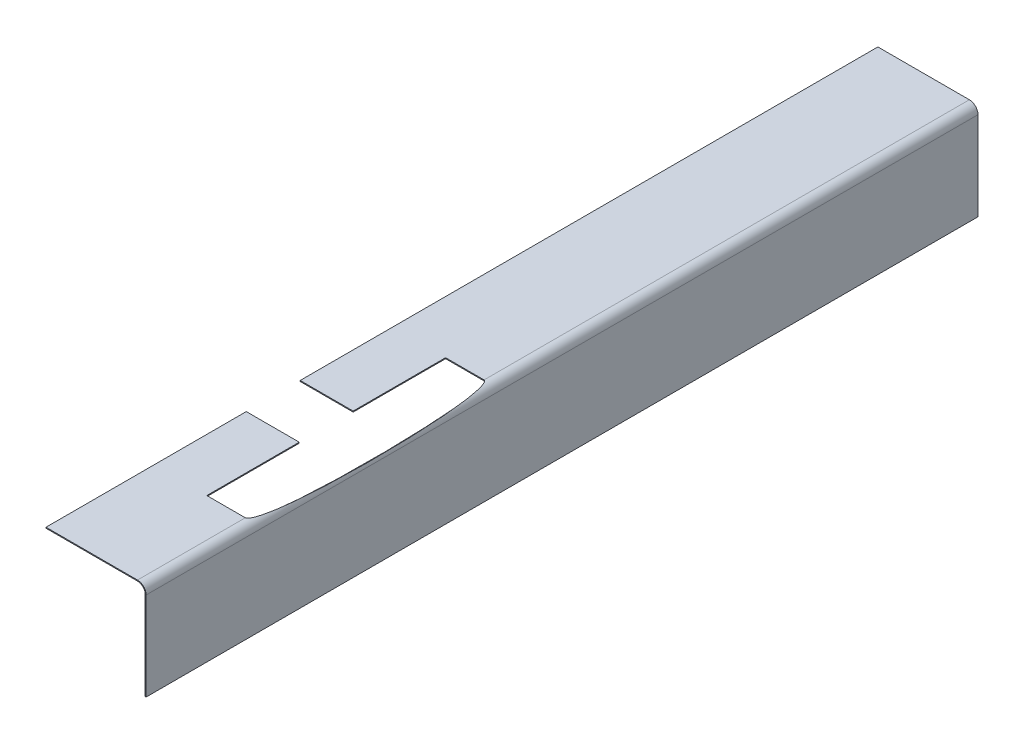
ISO-10303-21;
HEADER;
FILE_DESCRIPTION(('STEP AP214'),'2;1');
FILE_NAME('part.step','',(''),(''),'','','');
FILE_SCHEMA(('AUTOMOTIVE_DESIGN { 1 0 10303 214 1 1 1 1 }'));
ENDSEC;
DATA;
#1=APPLICATION_CONTEXT('core data for automotive mechanical design processes');
#2=APPLICATION_PROTOCOL_DEFINITION('international standard','automotive_design',2000,#1);
#3=PRODUCT_CONTEXT('',#1,'mechanical');
#4=PRODUCT('Part','Part','',(#3));
#5=PRODUCT_RELATED_PRODUCT_CATEGORY('part','',(#4));
#6=PRODUCT_DEFINITION_FORMATION('','',#4);
#7=PRODUCT_DEFINITION_CONTEXT('part definition',#1,'design');
#8=PRODUCT_DEFINITION('design','',#6,#7);
#9=PRODUCT_DEFINITION_SHAPE('','',#8);
#10=(LENGTH_UNIT() NAMED_UNIT(*) SI_UNIT(.MILLI.,.METRE.));
#11=(NAMED_UNIT(*) PLANE_ANGLE_UNIT() SI_UNIT($,.RADIAN.));
#12=(NAMED_UNIT(*) SI_UNIT($,.STERADIAN.) SOLID_ANGLE_UNIT());
#13=UNCERTAINTY_MEASURE_WITH_UNIT(LENGTH_MEASURE(1.E-05),#10,'distance_accuracy_value','');
#14=(GEOMETRIC_REPRESENTATION_CONTEXT(3) GLOBAL_UNCERTAINTY_ASSIGNED_CONTEXT((#13)) GLOBAL_UNIT_ASSIGNED_CONTEXT((#10,
#11,#12)) REPRESENTATION_CONTEXT('',''));
#15=CARTESIAN_POINT('',(0.,0.,0.));
#16=DIRECTION('',(0.,0.,1.));
#17=DIRECTION('',(1.,0.,0.));
#18=AXIS2_PLACEMENT_3D('',#15,#16,#17);
#19=CARTESIAN_POINT('',(65.,0.,0.));
#20=DIRECTION('',(0.,0.,-1.));
#21=DIRECTION('',(0.,-1.,0.));
#22=AXIS2_PLACEMENT_3D('',#19,#20,#21);
#23=PLANE('',#22);
#24=DIRECTION('',(1.,0.,0.));
#25=VECTOR('',#24,1.);
#26=CARTESIAN_POINT('',(65.,57.39294,0.));
#27=LINE('',#26,#25);
#28=CARTESIAN_POINT('',(64.39294,57.39294,0.));
#29=VERTEX_POINT('',#28);
#30=CARTESIAN_POINT('',(65.,57.39294,0.));
#31=VERTEX_POINT('',#30);
#32=EDGE_CURVE('E11',#29,#31,#27,.T.);
#33=ORIENTED_EDGE('',*,*,#32,.F.);
#34=DIRECTION('',(0.,1.,0.));
#35=VECTOR('',#34,1.);
#36=CARTESIAN_POINT('',(64.39294,0.,0.));
#37=LINE('',#36,#35);
#38=CARTESIAN_POINT('',(64.39294,0.,0.));
#39=VERTEX_POINT('',#38);
#40=EDGE_CURVE('E115',#29,#39,#37,.F.);
#41=ORIENTED_EDGE('',*,*,#40,.T.);
#42=DIRECTION('',(1.,0.,0.));
#43=VECTOR('',#42,1.);
#44=CARTESIAN_POINT('',(65.,0.,0.));
#45=LINE('',#44,#43);
#46=CARTESIAN_POINT('',(65.,0.,0.));
#47=VERTEX_POINT('',#46);
#48=EDGE_CURVE('E50',#39,#47,#45,.T.);
#49=ORIENTED_EDGE('',*,*,#48,.T.);
#50=DIRECTION('',(0.,-1.,0.));
#51=VECTOR('',#50,1.);
#52=CARTESIAN_POINT('',(65.,0.,0.));
#53=LINE('',#52,#51);
#54=EDGE_CURVE('E118',#31,#47,#53,.T.);
#55=ORIENTED_EDGE('',*,*,#54,.F.);
#56=EDGE_LOOP('',(#33,#41,#49,#55));
#57=FACE_BOUND('',#56,.T.);
#58=ADVANCED_FACE('F40',(#57),#23,.F.);
#59=CARTESIAN_POINT('',(65.,0.,0.));
#60=DIRECTION('',(0.,1.,0.));
#61=DIRECTION('',(0.,0.,-1.));
#62=AXIS2_PLACEMENT_3D('',#59,#60,#61);
#63=PLANE('',#62);
#64=ORIENTED_EDGE('',*,*,#48,.F.);
#65=DIRECTION('',(0.,0.,1.));
#66=VECTOR('',#65,1.);
#67=CARTESIAN_POINT('',(64.39294,0.,0.));
#68=LINE('',#67,#66);
#69=CARTESIAN_POINT('',(64.39294,0.,-540.));
#70=VERTEX_POINT('',#69);
#71=EDGE_CURVE('E146',#39,#70,#68,.F.);
#72=ORIENTED_EDGE('',*,*,#71,.T.);
#73=DIRECTION('',(1.,0.,0.));
#74=VECTOR('',#73,1.);
#75=CARTESIAN_POINT('',(65.,0.,-540.));
#76=LINE('',#75,#74);
#77=CARTESIAN_POINT('',(65.,0.,-540.));
#78=VERTEX_POINT('',#77);
#79=EDGE_CURVE('E312',#70,#78,#76,.T.);
#80=ORIENTED_EDGE('',*,*,#79,.T.);
#81=DIRECTION('',(0.,0.,-1.));
#82=VECTOR('',#81,1.);
#83=CARTESIAN_POINT('',(65.,0.,0.));
#84=LINE('',#83,#82);
#85=EDGE_CURVE('E322',#47,#78,#84,.T.);
#86=ORIENTED_EDGE('',*,*,#85,.F.);
#87=EDGE_LOOP('',(#64,#72,#80,#86));
#88=FACE_BOUND('',#87,.T.);
#89=ADVANCED_FACE('F327',(#88),#63,.F.);
#90=CARTESIAN_POINT('',(65.,0.,-540.));
#91=DIRECTION('',(0.,0.,1.));
#92=DIRECTION('',(0.,1.,0.));
#93=AXIS2_PLACEMENT_3D('',#90,#91,#92);
#94=PLANE('',#93);
#95=ORIENTED_EDGE('',*,*,#79,.F.);
#96=DIRECTION('',(0.,1.,0.));
#97=VECTOR('',#96,1.);
#98=CARTESIAN_POINT('',(64.39294,0.,-540.));
#99=LINE('',#98,#97);
#100=CARTESIAN_POINT('',(64.39294,57.39294,-540.));
#101=VERTEX_POINT('',#100);
#102=EDGE_CURVE('E374',#70,#101,#99,.T.);
#103=ORIENTED_EDGE('',*,*,#102,.T.);
#104=DIRECTION('',(1.,0.,0.));
#105=VECTOR('',#104,1.);
#106=CARTESIAN_POINT('',(65.,57.39294,-540.));
#107=LINE('',#106,#105);
#108=CARTESIAN_POINT('',(65.,57.39294,-540.));
#109=VERTEX_POINT('',#108);
#110=EDGE_CURVE('E309',#101,#109,#107,.T.);
#111=ORIENTED_EDGE('',*,*,#110,.T.);
#112=DIRECTION('',(0.,1.,0.));
#113=VECTOR('',#112,1.);
#114=CARTESIAN_POINT('',(65.,0.,-540.));
#115=LINE('',#114,#113);
#116=EDGE_CURVE('E328',#78,#109,#115,.T.);
#117=ORIENTED_EDGE('',*,*,#116,.F.);
#118=EDGE_LOOP('',(#95,#103,#111,#117));
#119=FACE_BOUND('',#118,.T.);
#120=ADVANCED_FACE('F386',(#119),#94,.F.);
#121=CARTESIAN_POINT('',(59.39294,57.39294,-540.));
#122=DIRECTION('',(0.,0.,1.));
#123=DIRECTION('',(1.,0.,0.));
#124=AXIS2_PLACEMENT_3D('',#121,#122,#123);
#125=PLANE('',#124);
#126=ORIENTED_EDGE('',*,*,#110,.F.);
#127=CARTESIAN_POINT('',(59.39294,57.39294,-540.));
#128=DIRECTION('',(0.,0.,1.));
#129=DIRECTION('',(1.,0.,0.));
#130=AXIS2_PLACEMENT_3D('',#127,#128,#129);
#131=CIRCLE('',#130,5.);
#132=CARTESIAN_POINT('',(59.39294,62.39294,-540.));
#133=VERTEX_POINT('',#132);
#134=EDGE_CURVE('E136',#101,#133,#131,.T.);
#135=ORIENTED_EDGE('',*,*,#134,.T.);
#136=DIRECTION('',(0.,1.,0.));
#137=VECTOR('',#136,1.);
#138=CARTESIAN_POINT('',(59.39294,63.,-540.));
#139=LINE('',#138,#137);
#140=CARTESIAN_POINT('',(59.39294,63.,-540.));
#141=VERTEX_POINT('',#140);
#142=EDGE_CURVE('E306',#133,#141,#139,.T.);
#143=ORIENTED_EDGE('',*,*,#142,.T.);
#144=CARTESIAN_POINT('',(59.39294,57.39294,-540.));
#145=DIRECTION('',(0.,0.,-1.));
#146=DIRECTION('',(-1.,0.,0.));
#147=AXIS2_PLACEMENT_3D('',#144,#145,#146);
#148=CIRCLE('',#147,5.60706);
#149=EDGE_CURVE('E358',#109,#141,#148,.F.);
#150=ORIENTED_EDGE('',*,*,#149,.F.);
#151=EDGE_LOOP('',(#126,#135,#143,#150));
#152=FACE_BOUND('',#151,.T.);
#153=ADVANCED_FACE('F394',(#152),#125,.F.);
#154=CARTESIAN_POINT('',(65.,63.,-540.));
#155=DIRECTION('',(0.,0.,1.));
#156=DIRECTION('',(-1.,0.,0.));
#157=AXIS2_PLACEMENT_3D('',#154,#155,#156);
#158=PLANE('',#157);
#159=ORIENTED_EDGE('',*,*,#142,.F.);
#160=DIRECTION('',(1.,0.,0.));
#161=VECTOR('',#160,1.);
#162=CARTESIAN_POINT('',(65.,62.39294,-540.));
#163=LINE('',#162,#161);
#164=CARTESIAN_POINT('',(0.,62.39294,-540.));
#165=VERTEX_POINT('',#164);
#166=EDGE_CURVE('E364',#133,#165,#163,.F.);
#167=ORIENTED_EDGE('',*,*,#166,.T.);
#168=DIRECTION('',(0.,1.,0.));
#169=VECTOR('',#168,1.);
#170=CARTESIAN_POINT('',(0.,63.,-540.));
#171=LINE('',#170,#169);
#172=CARTESIAN_POINT('',(0.,63.,-540.));
#173=VERTEX_POINT('',#172);
#174=EDGE_CURVE('E303',#165,#173,#171,.T.);
#175=ORIENTED_EDGE('',*,*,#174,.T.);
#176=DIRECTION('',(-1.,0.,0.));
#177=VECTOR('',#176,1.);
#178=CARTESIAN_POINT('',(65.,63.,-540.));
#179=LINE('',#178,#177);
#180=EDGE_CURVE('E345',#141,#173,#179,.T.);
#181=ORIENTED_EDGE('',*,*,#180,.F.);
#182=EDGE_LOOP('',(#159,#167,#175,#181));
#183=FACE_BOUND('',#182,.T.);
#184=ADVANCED_FACE('F463',(#183),#158,.F.);
#185=CARTESIAN_POINT('',(0.,63.,0.));
#186=DIRECTION('',(1.,0.,0.));
#187=DIRECTION('',(0.,0.,1.));
#188=AXIS2_PLACEMENT_3D('',#185,#186,#187);
#189=PLANE('',#188);
#190=ORIENTED_EDGE('',*,*,#174,.F.);
#191=DIRECTION('',(0.,0.,-1.));
#192=VECTOR('',#191,1.);
#193=CARTESIAN_POINT('',(0.,62.39294,0.));
#194=LINE('',#193,#192);
#195=CARTESIAN_POINT('',(0.,62.39294,-165.));
#196=VERTEX_POINT('',#195);
#197=EDGE_CURVE('E380',#165,#196,#194,.F.);
#198=ORIENTED_EDGE('',*,*,#197,.T.);
#199=DIRECTION('',(0.,1.,0.));
#200=VECTOR('',#199,1.);
#201=CARTESIAN_POINT('',(0.,63.,-165.));
#202=LINE('',#201,#200);
#203=CARTESIAN_POINT('',(0.,63.,-165.));
#204=VERTEX_POINT('',#203);
#205=EDGE_CURVE('E300',#196,#204,#202,.T.);
#206=ORIENTED_EDGE('',*,*,#205,.T.);
#207=DIRECTION('',(0.,0.,1.));
#208=VECTOR('',#207,1.);
#209=CARTESIAN_POINT('',(0.,63.,0.));
#210=LINE('',#209,#208);
#211=EDGE_CURVE('E342',#173,#204,#210,.T.);
#212=ORIENTED_EDGE('',*,*,#211,.F.);
#213=EDGE_LOOP('',(#190,#198,#206,#212));
#214=FACE_BOUND('',#213,.T.);
#215=ADVANCED_FACE('F452',(#214),#189,.F.);
#216=CARTESIAN_POINT('',(0.,63.,-165.));
#217=DIRECTION('',(0.,0.,1.));
#218=DIRECTION('',(-1.,0.,0.));
#219=AXIS2_PLACEMENT_3D('',#216,#217,#218);
#220=PLANE('',#219);
#221=ORIENTED_EDGE('',*,*,#205,.F.);
#222=DIRECTION('',(1.,0.,0.));
#223=VECTOR('',#222,1.);
#224=CARTESIAN_POINT('',(65.,62.39294,-165.));
#225=LINE('',#224,#223);
#226=CARTESIAN_POINT('',(34.39294,62.39294,-165.));
#227=VERTEX_POINT('',#226);
#228=EDGE_CURVE('E377',#227,#196,#225,.F.);
#229=ORIENTED_EDGE('',*,*,#228,.F.);
#230=DIRECTION('',(0.,1.,0.));
#231=VECTOR('',#230,1.);
#232=CARTESIAN_POINT('',(34.39294,63.,-165.));
#233=LINE('',#232,#231);
#234=CARTESIAN_POINT('',(34.39294,63.,-165.));
#235=VERTEX_POINT('',#234);
#236=EDGE_CURVE('E297',#227,#235,#233,.T.);
#237=ORIENTED_EDGE('',*,*,#236,.T.);
#238=DIRECTION('',(-1.,0.,0.));
#239=VECTOR('',#238,1.);
#240=CARTESIAN_POINT('',(0.,63.,-165.));
#241=LINE('',#240,#239);
#242=EDGE_CURVE('E348',#235,#204,#241,.T.);
#243=ORIENTED_EDGE('',*,*,#242,.T.);
#244=EDGE_LOOP('',(#221,#229,#237,#243));
#245=FACE_BOUND('',#244,.T.);
#246=ADVANCED_FACE('F467',(#245),#220,.T.);
#247=CARTESIAN_POINT('',(34.39294,63.,-165.));
#248=DIRECTION('',(1.,0.,0.));
#249=DIRECTION('',(0.,0.,1.));
#250=AXIS2_PLACEMENT_3D('',#247,#248,#249);
#251=PLANE('',#250);
#252=ORIENTED_EDGE('',*,*,#236,.F.);
#253=DIRECTION('',(0.,0.,-1.));
#254=VECTOR('',#253,1.);
#255=CARTESIAN_POINT('',(34.39294,62.39294,0.));
#256=LINE('',#255,#254);
#257=CARTESIAN_POINT('',(34.39294,62.39294,-225.));
#258=VERTEX_POINT('',#257);
#259=EDGE_CURVE('E208',#258,#227,#256,.F.);
#260=ORIENTED_EDGE('',*,*,#259,.F.);
#261=DIRECTION('',(0.,1.,0.));
#262=VECTOR('',#261,1.);
#263=CARTESIAN_POINT('',(34.39294,63.,-225.));
#264=LINE('',#263,#262);
#265=CARTESIAN_POINT('',(34.39294,63.,-225.));
#266=VERTEX_POINT('',#265);
#267=EDGE_CURVE('E289',#258,#266,#264,.T.);
#268=ORIENTED_EDGE('',*,*,#267,.T.);
#269=DIRECTION('',(0.,0.,1.));
#270=VECTOR('',#269,1.);
#271=CARTESIAN_POINT('',(34.39294,63.,-165.));
#272=LINE('',#271,#270);
#273=EDGE_CURVE('E351',#266,#235,#272,.T.);
#274=ORIENTED_EDGE('',*,*,#273,.T.);
#275=EDGE_LOOP('',(#252,#260,#268,#274));
#276=FACE_BOUND('',#275,.T.);
#277=ADVANCED_FACE('F469',(#276),#251,.T.);
#278=CARTESIAN_POINT('',(64.39294,63.,-225.));
#279=DIRECTION('',(0.,0.,1.));
#280=DIRECTION('',(-1.,0.,0.));
#281=AXIS2_PLACEMENT_3D('',#278,#279,#280);
#282=PLANE('',#281);
#283=ORIENTED_EDGE('',*,*,#267,.F.);
#284=DIRECTION('',(1.,0.,0.));
#285=VECTOR('',#284,1.);
#286=CARTESIAN_POINT('',(65.,62.39294,-225.));
#287=LINE('',#286,#285);
#288=CARTESIAN_POINT('',(59.39294,62.39294,-225.));
#289=VERTEX_POINT('',#288);
#290=EDGE_CURVE('E163',#289,#258,#287,.F.);
#291=ORIENTED_EDGE('',*,*,#290,.F.);
#292=CARTESIAN_POINT('',(59.39294,63.,-225.));
#293=CARTESIAN_POINT('',(59.39294,62.39294,-225.));
#294=B_SPLINE_CURVE_WITH_KNOTS('',1,(#292,#293),.UNSPECIFIED.,.F.,.F.,(2,2),(0.,1.),.UNSPECIFIED.);
#295=CARTESIAN_POINT('',(59.39294,63.,-225.));
#296=VERTEX_POINT('',#295);
#297=EDGE_CURVE('E275',#289,#296,#294,.F.);
#298=ORIENTED_EDGE('',*,*,#297,.T.);
#299=DIRECTION('',(-1.,0.,0.));
#300=VECTOR('',#299,1.);
#301=CARTESIAN_POINT('',(64.39294,63.,-225.));
#302=LINE('',#301,#300);
#303=EDGE_CURVE('E354',#296,#266,#302,.T.);
#304=ORIENTED_EDGE('',*,*,#303,.T.);
#305=EDGE_LOOP('',(#283,#291,#298,#304));
#306=FACE_BOUND('',#305,.T.);
#307=ADVANCED_FACE('F232',(#306),#282,.T.);
#308=CARTESIAN_POINT('',(59.39294,63.,-70.));
#309=CARTESIAN_POINT('',(59.9439072816161,63.,-70.));
#310=CARTESIAN_POINT('',(60.4581261599273,62.9189240199828,-70.60546875));
#311=CARTESIAN_POINT('',(61.3849624346511,62.6563008620588,-72.8759765625));
#312=CARTESIAN_POINT('',(61.79743095517,62.4750648911321,-74.541015625));
#313=CARTESIAN_POINT('',(62.5158685202779,62.0680750375999,-78.779296875));
#314=CARTESIAN_POINT('',(62.8221715262878,61.8424186066325,-81.3525390625));
#315=CARTESIAN_POINT('',(63.3404316691489,61.3897885402585,-87.255859375));
#316=CARTESIAN_POINT('',(63.5526481771482,61.1627814466649,-90.5859375));
#317=CARTESIAN_POINT('',(63.901863808116,60.7372609691403,-97.8515625));
#318=CARTESIAN_POINT('',(64.0390359218209,60.5386555956284,-101.787109375));
#319=CARTESIAN_POINT('',(64.2577673992447,60.1885058280387,-110.1123046875));
#320=CARTESIAN_POINT('',(64.3394276576013,60.0368614055839,-114.501953125));
#321=CARTESIAN_POINT('',(64.4631768429214,59.7910139985224,-123.583984375));
#322=CARTESIAN_POINT('',(64.5053167567328,59.6967326157415,-128.2763671875));
#323=CARTESIAN_POINT('',(64.560312222709,59.5705811162315,-137.8125));
#324=CARTESIAN_POINT('',(64.5731879715627,59.538668966277,-142.65625));
#325=CARTESIAN_POINT('',(64.5731879715627,59.538668966277,-152.34375));
#326=CARTESIAN_POINT('',(64.560312222709,59.5705811162315,-157.1875));
#327=CARTESIAN_POINT('',(64.5053167567328,59.6967326157415,-166.7236328125));
#328=CARTESIAN_POINT('',(64.4631768429214,59.7910139985224,-171.416015625));
#329=CARTESIAN_POINT('',(64.3394276576013,60.0368614055839,-180.498046875));
#330=CARTESIAN_POINT('',(64.2577673992447,60.1885058280387,-184.8876953125));
#331=CARTESIAN_POINT('',(64.0390359218209,60.5386555956284,-193.212890625));
#332=CARTESIAN_POINT('',(63.901863808116,60.7372609691403,-197.1484375));
#333=CARTESIAN_POINT('',(63.5526481771482,61.1627814466649,-204.4140625));
#334=CARTESIAN_POINT('',(63.3404316691489,61.3897885402585,-207.744140625));
#335=CARTESIAN_POINT('',(62.8221715262878,61.8424186066325,-213.6474609375));
#336=CARTESIAN_POINT('',(62.5158685202779,62.0680750375999,-216.220703125));
#337=CARTESIAN_POINT('',(61.79743095517,62.4750648911321,-220.458984375));
#338=CARTESIAN_POINT('',(61.3849624346511,62.6563008620588,-222.1240234375));
#339=CARTESIAN_POINT('',(60.4581261599273,62.9189240199828,-224.39453125));
#340=CARTESIAN_POINT('',(59.9439072816161,63.,-225.));
#341=CARTESIAN_POINT('',(59.39294,63.,-225.));
#342=CARTESIAN_POINT('',(59.39294,62.39294,-70.));
#343=CARTESIAN_POINT('',(59.8842556641948,62.39294,-70.));
#344=CARTESIAN_POINT('',(60.3428015673163,62.3206418794009,-70.60546875));
#345=CARTESIAN_POINT('',(61.1692919871832,62.0864521632895,-72.8759765625));
#346=CARTESIAN_POINT('',(61.5371037463929,61.9248380812869,-74.541015625));
#347=CARTESIAN_POINT('',(62.1777581759049,61.5619118298002,-78.779296875));
#348=CARTESIAN_POINT('',(62.450898650601,61.3606865611501,-81.3525390625));
#349=CARTESIAN_POINT('',(62.9130482823698,60.957061429286,-87.255859375));
#350=CARTESIAN_POINT('',(63.1022887292344,60.7546317303051,-90.5859375));
#351=CARTESIAN_POINT('',(63.413695804393,60.3751811113313,-97.8515625));
#352=CARTESIAN_POINT('',(63.536016694222,60.1980781612007,-101.787109375));
#353=CARTESIAN_POINT('',(63.731066753811,59.8858380856623,-110.1123046875));
#354=CARTESIAN_POINT('',(63.8038858946411,59.7506117616576,-114.501953125));
#355=CARTESIAN_POINT('',(63.9142371173141,59.5313815348885,-123.583984375));
#356=CARTESIAN_POINT('',(63.9518146658077,59.4473077218913,-128.2763671875));
#357=CARTESIAN_POINT('',(64.0008559334027,59.3348142765652,-137.8125));
#358=CARTESIAN_POINT('',(64.0123376625564,59.3063571618255,-142.65625));
#359=CARTESIAN_POINT('',(64.0123376625564,59.3063571618255,-152.34375));
#360=CARTESIAN_POINT('',(64.0008559334027,59.3348142765652,-157.1875));
#361=CARTESIAN_POINT('',(63.9518146658077,59.4473077218913,-166.7236328125));
#362=CARTESIAN_POINT('',(63.9142371173141,59.5313815348885,-171.416015625));
#363=CARTESIAN_POINT('',(63.8038858946411,59.7506117616576,-180.498046875));
#364=CARTESIAN_POINT('',(63.731066753811,59.8858380856623,-184.8876953125));
#365=CARTESIAN_POINT('',(63.536016694222,60.1980781612007,-193.212890625));
#366=CARTESIAN_POINT('',(63.413695804393,60.3751811113313,-197.1484375));
#367=CARTESIAN_POINT('',(63.1022887292344,60.7546317303051,-204.4140625));
#368=CARTESIAN_POINT('',(62.9130482823698,60.957061429286,-207.744140625));
#369=CARTESIAN_POINT('',(62.450898650601,61.3606865611501,-213.6474609375));
#370=CARTESIAN_POINT('',(62.1777581759049,61.5619118298002,-216.220703125));
#371=CARTESIAN_POINT('',(61.5371037463929,61.9248380812869,-220.458984375));
#372=CARTESIAN_POINT('',(61.1692919871832,62.0864521632895,-222.1240234375));
#373=CARTESIAN_POINT('',(60.3428015673163,62.3206418794009,-224.39453125));
#374=CARTESIAN_POINT('',(59.8842556641948,62.39294,-225.));
#375=CARTESIAN_POINT('',(59.39294,62.39294,-225.));
#376=B_SPLINE_SURFACE_WITH_KNOTS('',1,3,((#308,#309,#310,#311,#312,#313,#314,#315,#316,#317,
#318,#319,#320,#321,#322,#323,#324,#325,#326,#327,#328,#329,#330,#331,#332,#333,#334,#335,#336,
#337,#338,#339,#340,#341),(#342,#343,#344,#345,#346,#347,#348,#349,#350,#351,#352,#353,#354,
#355,#356,#357,#358,#359,#360,#361,#362,#363,#364,#365,#366,#367,#368,#369,#370,#371,#372,#373,
#374,#375)),.UNSPECIFIED.,.F.,.F.,.F.,(2,2),(4,2,2,2,2,2,2,2,2,2,2,2,2,2,2,2,4),(0.,1.),(0.,
0.0625,0.125,0.1875,0.25,0.3125,0.375,0.4375,0.5,0.5625,0.625,0.6875,0.75,0.8125,0.875,0.9375,
1.),.UNSPECIFIED.);
#377=CARTESIAN_POINT('',(59.39294,62.39294,-225.));
#378=CARTESIAN_POINT('',(59.8842556641948,62.39294,-225.));
#379=CARTESIAN_POINT('',(60.3428015673163,62.3206418794009,-224.39453125));
#380=CARTESIAN_POINT('',(61.1692919871832,62.0864521632895,-222.1240234375));
#381=CARTESIAN_POINT('',(61.5371037463929,61.9248380812869,-220.458984375));
#382=CARTESIAN_POINT('',(62.1777581759049,61.5619118298002,-216.220703125));
#383=CARTESIAN_POINT('',(62.450898650601,61.3606865611501,-213.6474609375));
#384=CARTESIAN_POINT('',(62.9130482823698,60.957061429286,-207.744140625));
#385=CARTESIAN_POINT('',(63.1022887292344,60.7546317303051,-204.4140625));
#386=CARTESIAN_POINT('',(63.413695804393,60.3751811113313,-197.1484375));
#387=CARTESIAN_POINT('',(63.536016694222,60.1980781612007,-193.212890625));
#388=CARTESIAN_POINT('',(63.731066753811,59.8858380856623,-184.8876953125));
#389=CARTESIAN_POINT('',(63.8038858946411,59.7506117616576,-180.498046875));
#390=CARTESIAN_POINT('',(63.9142371173141,59.5313815348885,-171.416015625));
#391=CARTESIAN_POINT('',(63.9518146658077,59.4473077218913,-166.7236328125));
#392=CARTESIAN_POINT('',(64.0008559334027,59.3348142765652,-157.1875));
#393=CARTESIAN_POINT('',(64.0123376625564,59.3063571618255,-152.34375));
#394=CARTESIAN_POINT('',(64.0123376625564,59.3063571618255,-142.65625));
#395=CARTESIAN_POINT('',(64.0008559334027,59.3348142765652,-137.8125));
#396=CARTESIAN_POINT('',(63.9518146658077,59.4473077218913,-128.2763671875));
#397=CARTESIAN_POINT('',(63.9142371173141,59.5313815348885,-123.583984375));
#398=CARTESIAN_POINT('',(63.8038858946411,59.7506117616576,-114.501953125));
#399=CARTESIAN_POINT('',(63.731066753811,59.8858380856623,-110.1123046875));
#400=CARTESIAN_POINT('',(63.536016694222,60.1980781612007,-101.787109375));
#401=CARTESIAN_POINT('',(63.413695804393,60.3751811113313,-97.8515625));
#402=CARTESIAN_POINT('',(63.1022887292344,60.7546317303051,-90.5859375));
#403=CARTESIAN_POINT('',(62.9130482823698,60.957061429286,-87.255859375));
#404=CARTESIAN_POINT('',(62.450898650601,61.3606865611501,-81.3525390625));
#405=CARTESIAN_POINT('',(62.1777581759049,61.5619118298002,-78.779296875));
#406=CARTESIAN_POINT('',(61.5371037463929,61.9248380812869,-74.541015625));
#407=CARTESIAN_POINT('',(61.1692919871832,62.0864521632895,-72.8759765625));
#408=CARTESIAN_POINT('',(60.3428015673163,62.3206418794009,-70.60546875));
#409=CARTESIAN_POINT('',(59.8842556641948,62.39294,-70.));
#410=CARTESIAN_POINT('',(59.39294,62.39294,-70.));
#411=B_SPLINE_CURVE_WITH_KNOTS('',3,(#377,#378,#379,#380,#381,#382,#383,#384,#385,#386,#387,
#388,#389,#390,#391,#392,#393,#394,#395,#396,#397,#398,#399,#400,#401,#402,#403,#404,#405,#406,
#407,#408,#409,#410),.UNSPECIFIED.,.F.,.F.,(4,2,2,2,2,2,2,2,2,2,2,2,2,2,2,2,4),(0.,0.0625,0.125,
0.1875,0.25,0.3125,0.375,0.4375,0.5,0.5625,0.625,0.6875,0.75,0.8125,0.875,0.9375,1.),.UNSPECIFIED.);
#412=CARTESIAN_POINT('',(59.39294,62.39294,-70.));
#413=VERTEX_POINT('',#412);
#414=EDGE_CURVE('E147',#289,#413,#411,.T.);
#415=CARTESIAN_POINT('',(59.39294,62.39294,-70.));
#416=CARTESIAN_POINT('',(59.39294,63.,-70.));
#417=B_SPLINE_CURVE_WITH_KNOTS('',1,(#415,#416),.UNSPECIFIED.,.F.,.F.,(2,2),(0.,1.),.UNSPECIFIED.);
#418=CARTESIAN_POINT('',(59.39294,63.,-70.));
#419=VERTEX_POINT('',#418);
#420=EDGE_CURVE('E58',#413,#419,#417,.T.);
#421=CARTESIAN_POINT('',(59.39294,63.,-70.));
#422=CARTESIAN_POINT('',(59.9439072816161,63.,-70.));
#423=CARTESIAN_POINT('',(60.4581261599273,62.9189240199828,-70.60546875));
#424=CARTESIAN_POINT('',(61.3849624346511,62.6563008620588,-72.8759765625));
#425=CARTESIAN_POINT('',(61.79743095517,62.4750648911321,-74.541015625));
#426=CARTESIAN_POINT('',(62.5158685202779,62.0680750375999,-78.779296875));
#427=CARTESIAN_POINT('',(62.8221715262878,61.8424186066325,-81.3525390625));
#428=CARTESIAN_POINT('',(63.3404316691489,61.3897885402585,-87.255859375));
#429=CARTESIAN_POINT('',(63.5526481771482,61.1627814466649,-90.5859375));
#430=CARTESIAN_POINT('',(63.901863808116,60.7372609691403,-97.8515625));
#431=CARTESIAN_POINT('',(64.0390359218209,60.5386555956284,-101.787109375));
#432=CARTESIAN_POINT('',(64.2577673992447,60.1885058280387,-110.1123046875));
#433=CARTESIAN_POINT('',(64.3394276576013,60.0368614055839,-114.501953125));
#434=CARTESIAN_POINT('',(64.4631768429214,59.7910139985224,-123.583984375));
#435=CARTESIAN_POINT('',(64.5053167567328,59.6967326157415,-128.2763671875));
#436=CARTESIAN_POINT('',(64.560312222709,59.5705811162315,-137.8125));
#437=CARTESIAN_POINT('',(64.5731879715627,59.538668966277,-142.65625));
#438=CARTESIAN_POINT('',(64.5731879715627,59.538668966277,-152.34375));
#439=CARTESIAN_POINT('',(64.560312222709,59.5705811162315,-157.1875));
#440=CARTESIAN_POINT('',(64.5053167567328,59.6967326157415,-166.7236328125));
#441=CARTESIAN_POINT('',(64.4631768429214,59.7910139985224,-171.416015625));
#442=CARTESIAN_POINT('',(64.3394276576013,60.0368614055839,-180.498046875));
#443=CARTESIAN_POINT('',(64.2577673992447,60.1885058280387,-184.8876953125));
#444=CARTESIAN_POINT('',(64.0390359218209,60.5386555956284,-193.212890625));
#445=CARTESIAN_POINT('',(63.901863808116,60.7372609691403,-197.1484375));
#446=CARTESIAN_POINT('',(63.5526481771482,61.1627814466649,-204.4140625));
#447=CARTESIAN_POINT('',(63.3404316691489,61.3897885402585,-207.744140625));
#448=CARTESIAN_POINT('',(62.8221715262878,61.8424186066325,-213.6474609375));
#449=CARTESIAN_POINT('',(62.5158685202779,62.0680750375999,-216.220703125));
#450=CARTESIAN_POINT('',(61.79743095517,62.4750648911321,-220.458984375));
#451=CARTESIAN_POINT('',(61.3849624346511,62.6563008620588,-222.1240234375));
#452=CARTESIAN_POINT('',(60.4581261599273,62.9189240199828,-224.39453125));
#453=CARTESIAN_POINT('',(59.9439072816161,63.,-225.));
#454=CARTESIAN_POINT('',(59.39294,63.,-225.));
#455=B_SPLINE_CURVE_WITH_KNOTS('',3,(#421,#422,#423,#424,#425,#426,#427,#428,#429,#430,#431,
#432,#433,#434,#435,#436,#437,#438,#439,#440,#441,#442,#443,#444,#445,#446,#447,#448,#449,#450,
#451,#452,#453,#454),.UNSPECIFIED.,.F.,.F.,(4,2,2,2,2,2,2,2,2,2,2,2,2,2,2,2,4),(0.,0.0625,0.125,
0.1875,0.25,0.3125,0.375,0.4375,0.5,0.5625,0.625,0.6875,0.75,0.8125,0.875,0.9375,1.),.UNSPECIFIED.);
#456=EDGE_CURVE('E212',#296,#419,#455,.F.);
#457=ORIENTED_EDGE('',*,*,#297,.F.);
#458=ORIENTED_EDGE('',*,*,#414,.T.);
#459=ORIENTED_EDGE('',*,*,#420,.T.);
#460=ORIENTED_EDGE('',*,*,#456,.F.);
#461=EDGE_LOOP('',(#457,#458,#459,#460));
#462=FACE_BOUND('',#461,.T.);
#463=ADVANCED_FACE('F219',(#462),#376,.F.);
#464=CARTESIAN_POINT('',(64.39294,63.,-70.));
#465=DIRECTION('',(0.,0.,-1.));
#466=DIRECTION('',(1.,0.,0.));
#467=AXIS2_PLACEMENT_3D('',#464,#465,#466);
#468=PLANE('',#467);
#469=ORIENTED_EDGE('',*,*,#420,.F.);
#470=DIRECTION('',(1.,0.,0.));
#471=VECTOR('',#470,1.);
#472=CARTESIAN_POINT('',(65.,62.39294,-70.));
#473=LINE('',#472,#471);
#474=CARTESIAN_POINT('',(34.39294,62.39294,-70.));
#475=VERTEX_POINT('',#474);
#476=EDGE_CURVE('E141',#475,#413,#473,.T.);
#477=ORIENTED_EDGE('',*,*,#476,.F.);
#478=DIRECTION('',(0.,1.,0.));
#479=VECTOR('',#478,1.);
#480=CARTESIAN_POINT('',(34.39294,63.,-70.));
#481=LINE('',#480,#479);
#482=CARTESIAN_POINT('',(34.39294,63.,-70.));
#483=VERTEX_POINT('',#482);
#484=EDGE_CURVE('E430',#475,#483,#481,.T.);
#485=ORIENTED_EDGE('',*,*,#484,.T.);
#486=DIRECTION('',(1.,0.,0.));
#487=VECTOR('',#486,1.);
#488=CARTESIAN_POINT('',(64.39294,63.,-70.));
#489=LINE('',#488,#487);
#490=EDGE_CURVE('E170',#483,#419,#489,.T.);
#491=ORIENTED_EDGE('',*,*,#490,.T.);
#492=EDGE_LOOP('',(#469,#477,#485,#491));
#493=FACE_BOUND('',#492,.T.);
#494=ADVANCED_FACE('F231',(#493),#468,.T.);
#495=CARTESIAN_POINT('',(34.39294,63.,-130.));
#496=DIRECTION('',(1.,0.,0.));
#497=DIRECTION('',(0.,0.,1.));
#498=AXIS2_PLACEMENT_3D('',#495,#496,#497);
#499=PLANE('',#498);
#500=ORIENTED_EDGE('',*,*,#484,.F.);
#501=DIRECTION('',(0.,0.,-1.));
#502=VECTOR('',#501,1.);
#503=CARTESIAN_POINT('',(34.39294,62.39294,0.));
#504=LINE('',#503,#502);
#505=CARTESIAN_POINT('',(34.39294,62.39294,-130.));
#506=VERTEX_POINT('',#505);
#507=EDGE_CURVE('E371',#506,#475,#504,.F.);
#508=ORIENTED_EDGE('',*,*,#507,.F.);
#509=DIRECTION('',(0.,1.,0.));
#510=VECTOR('',#509,1.);
#511=CARTESIAN_POINT('',(34.39294,63.,-130.));
#512=LINE('',#511,#510);
#513=CARTESIAN_POINT('',(34.39294,63.,-130.));
#514=VERTEX_POINT('',#513);
#515=EDGE_CURVE('E424',#506,#514,#512,.T.);
#516=ORIENTED_EDGE('',*,*,#515,.T.);
#517=DIRECTION('',(0.,0.,1.));
#518=VECTOR('',#517,1.);
#519=CARTESIAN_POINT('',(34.39294,63.,-130.));
#520=LINE('',#519,#518);
#521=EDGE_CURVE('E330',#514,#483,#520,.T.);
#522=ORIENTED_EDGE('',*,*,#521,.T.);
#523=EDGE_LOOP('',(#500,#508,#516,#522));
#524=FACE_BOUND('',#523,.T.);
#525=ADVANCED_FACE('F426',(#524),#499,.T.);
#526=CARTESIAN_POINT('',(0.,63.,-130.));
#527=DIRECTION('',(0.,0.,-1.));
#528=DIRECTION('',(1.,0.,0.));
#529=AXIS2_PLACEMENT_3D('',#526,#527,#528);
#530=PLANE('',#529);
#531=ORIENTED_EDGE('',*,*,#515,.F.);
#532=DIRECTION('',(1.,0.,0.));
#533=VECTOR('',#532,1.);
#534=CARTESIAN_POINT('',(65.,62.39294,-130.));
#535=LINE('',#534,#533);
#536=CARTESIAN_POINT('',(0.,62.39294,-130.));
#537=VERTEX_POINT('',#536);
#538=EDGE_CURVE('E368',#537,#506,#535,.T.);
#539=ORIENTED_EDGE('',*,*,#538,.F.);
#540=DIRECTION('',(0.,1.,0.));
#541=VECTOR('',#540,1.);
#542=CARTESIAN_POINT('',(0.,63.,-130.));
#543=LINE('',#542,#541);
#544=CARTESIAN_POINT('',(0.,63.,-130.));
#545=VERTEX_POINT('',#544);
#546=EDGE_CURVE('E431',#537,#545,#543,.T.);
#547=ORIENTED_EDGE('',*,*,#546,.T.);
#548=DIRECTION('',(1.,0.,0.));
#549=VECTOR('',#548,1.);
#550=CARTESIAN_POINT('',(0.,63.,-130.));
#551=LINE('',#550,#549);
#552=EDGE_CURVE('E335',#545,#514,#551,.T.);
#553=ORIENTED_EDGE('',*,*,#552,.T.);
#554=EDGE_LOOP('',(#531,#539,#547,#553));
#555=FACE_BOUND('',#554,.T.);
#556=ADVANCED_FACE('F437',(#555),#530,.T.);
#557=ORIENTED_EDGE('',*,*,#546,.F.);
#558=DIRECTION('',(0.,0.,-1.));
#559=VECTOR('',#558,1.);
#560=CARTESIAN_POINT('',(0.,62.39294,0.));
#561=LINE('',#560,#559);
#562=CARTESIAN_POINT('',(0.,62.39294,0.));
#563=VERTEX_POINT('',#562);
#564=EDGE_CURVE('E365',#537,#563,#561,.F.);
#565=ORIENTED_EDGE('',*,*,#564,.T.);
#566=DIRECTION('',(0.,1.,0.));
#567=VECTOR('',#566,1.);
#568=CARTESIAN_POINT('',(0.,63.,0.));
#569=LINE('',#568,#567);
#570=CARTESIAN_POINT('',(0.,63.,0.));
#571=VERTEX_POINT('',#570);
#572=EDGE_CURVE('E440',#563,#571,#569,.T.);
#573=ORIENTED_EDGE('',*,*,#572,.T.);
#574=EDGE_CURVE('E338',#545,#571,#210,.T.);
#575=ORIENTED_EDGE('',*,*,#574,.F.);
#576=EDGE_LOOP('',(#557,#565,#573,#575));
#577=FACE_BOUND('',#576,.T.);
#578=ADVANCED_FACE('F443',(#577),#189,.F.);
#579=CARTESIAN_POINT('',(65.,63.,0.));
#580=DIRECTION('',(0.,0.,1.));
#581=DIRECTION('',(-1.,0.,0.));
#582=AXIS2_PLACEMENT_3D('',#579,#580,#581);
#583=PLANE('',#582);
#584=ORIENTED_EDGE('',*,*,#572,.F.);
#585=DIRECTION('',(1.,0.,0.));
#586=VECTOR('',#585,1.);
#587=CARTESIAN_POINT('',(65.,62.39294,0.));
#588=LINE('',#587,#586);
#589=CARTESIAN_POINT('',(59.39294,62.39294,0.));
#590=VERTEX_POINT('',#589);
#591=EDGE_CURVE('E361',#590,#563,#588,.F.);
#592=ORIENTED_EDGE('',*,*,#591,.F.);
#593=DIRECTION('',(0.,1.,0.));
#594=VECTOR('',#593,1.);
#595=CARTESIAN_POINT('',(59.39294,63.,0.));
#596=LINE('',#595,#594);
#597=CARTESIAN_POINT('',(59.39294,63.,0.));
#598=VERTEX_POINT('',#597);
#599=EDGE_CURVE('E44',#590,#598,#596,.T.);
#600=ORIENTED_EDGE('',*,*,#599,.T.);
#601=DIRECTION('',(-1.,0.,0.));
#602=VECTOR('',#601,1.);
#603=CARTESIAN_POINT('',(65.,63.,0.));
#604=LINE('',#603,#602);
#605=EDGE_CURVE('E341',#598,#571,#604,.T.);
#606=ORIENTED_EDGE('',*,*,#605,.T.);
#607=EDGE_LOOP('',(#584,#592,#600,#606));
#608=FACE_BOUND('',#607,.T.);
#609=ADVANCED_FACE('F444',(#608),#583,.T.);
#610=CARTESIAN_POINT('',(59.39294,57.39294,0.));
#611=DIRECTION('',(0.,0.,1.));
#612=DIRECTION('',(1.,0.,0.));
#613=AXIS2_PLACEMENT_3D('',#610,#611,#612);
#614=PLANE('',#613);
#615=CARTESIAN_POINT('',(59.39294,57.39294,0.));
#616=DIRECTION('',(0.,0.,1.));
#617=DIRECTION('',(1.,0.,0.));
#618=AXIS2_PLACEMENT_3D('',#615,#616,#617);
#619=CIRCLE('',#618,5.);
#620=EDGE_CURVE('E132',#590,#29,#619,.F.);
#621=ORIENTED_EDGE('',*,*,#620,.T.);
#622=ORIENTED_EDGE('',*,*,#32,.T.);
#623=CARTESIAN_POINT('',(59.39294,57.39294,0.));
#624=DIRECTION('',(0.,0.,-1.));
#625=DIRECTION('',(-1.,0.,0.));
#626=AXIS2_PLACEMENT_3D('',#623,#624,#625);
#627=CIRCLE('',#626,5.60706);
#628=EDGE_CURVE('E158',#598,#31,#627,.T.);
#629=ORIENTED_EDGE('',*,*,#628,.F.);
#630=ORIENTED_EDGE('',*,*,#599,.F.);
#631=EDGE_LOOP('',(#621,#622,#629,#630));
#632=FACE_BOUND('',#631,.T.);
#633=ADVANCED_FACE('F42',(#632),#614,.T.);
#634=CARTESIAN_POINT('',(65.,63.,0.));
#635=DIRECTION('',(0.,-1.,0.));
#636=DIRECTION('',(0.,0.,-1.));
#637=AXIS2_PLACEMENT_3D('',#634,#635,#636);
#638=PLANE('',#637);
#639=ORIENTED_EDGE('',*,*,#605,.F.);
#640=DIRECTION('',(0.,0.,1.));
#641=VECTOR('',#640,1.);
#642=CARTESIAN_POINT('',(59.39294,63.,0.));
#643=LINE('',#642,#641);
#644=EDGE_CURVE('E398',#598,#419,#643,.F.);
#645=ORIENTED_EDGE('',*,*,#644,.T.);
#646=ORIENTED_EDGE('',*,*,#490,.F.);
#647=ORIENTED_EDGE('',*,*,#521,.F.);
#648=ORIENTED_EDGE('',*,*,#552,.F.);
#649=ORIENTED_EDGE('',*,*,#574,.T.);
#650=EDGE_LOOP('',(#639,#645,#646,#647,#648,#649));
#651=FACE_BOUND('',#650,.T.);
#652=ADVANCED_FACE('F435',(#651),#638,.F.);
#653=ORIENTED_EDGE('',*,*,#303,.F.);
#654=DIRECTION('',(0.,0.,1.));
#655=VECTOR('',#654,1.);
#656=CARTESIAN_POINT('',(59.39294,63.,0.));
#657=LINE('',#656,#655);
#658=EDGE_CURVE('E356',#296,#141,#657,.F.);
#659=ORIENTED_EDGE('',*,*,#658,.T.);
#660=ORIENTED_EDGE('',*,*,#180,.T.);
#661=ORIENTED_EDGE('',*,*,#211,.T.);
#662=ORIENTED_EDGE('',*,*,#242,.F.);
#663=ORIENTED_EDGE('',*,*,#273,.F.);
#664=EDGE_LOOP('',(#653,#659,#660,#661,#662,#663));
#665=FACE_BOUND('',#664,.T.);
#666=ADVANCED_FACE('F186',(#665),#638,.F.);
#667=CARTESIAN_POINT('',(65.,0.,0.));
#668=DIRECTION('',(-1.,0.,0.));
#669=DIRECTION('',(0.,0.,1.));
#670=AXIS2_PLACEMENT_3D('',#667,#668,#669);
#671=PLANE('',#670);
#672=ORIENTED_EDGE('',*,*,#116,.T.);
#673=DIRECTION('',(0.,0.,1.));
#674=VECTOR('',#673,1.);
#675=CARTESIAN_POINT('',(65.,57.39294,0.));
#676=LINE('',#675,#674);
#677=EDGE_CURVE('E325',#109,#31,#676,.T.);
#678=ORIENTED_EDGE('',*,*,#677,.T.);
#679=ORIENTED_EDGE('',*,*,#54,.T.);
#680=ORIENTED_EDGE('',*,*,#85,.T.);
#681=EDGE_LOOP('',(#672,#678,#679,#680));
#682=FACE_BOUND('',#681,.T.);
#683=ADVANCED_FACE('F184',(#682),#671,.F.);
#684=CARTESIAN_POINT('',(59.39294,57.39294,0.));
#685=DIRECTION('',(0.,0.,1.));
#686=DIRECTION('',(1.,0.,0.));
#687=AXIS2_PLACEMENT_3D('',#684,#685,#686);
#688=CYLINDRICAL_SURFACE('',#687,5.60706);
#689=ORIENTED_EDGE('',*,*,#456,.T.);
#690=ORIENTED_EDGE('',*,*,#644,.F.);
#691=ORIENTED_EDGE('',*,*,#628,.T.);
#692=ORIENTED_EDGE('',*,*,#677,.F.);
#693=ORIENTED_EDGE('',*,*,#149,.T.);
#694=ORIENTED_EDGE('',*,*,#658,.F.);
#695=EDGE_LOOP('',(#689,#690,#691,#692,#693,#694));
#696=FACE_BOUND('',#695,.T.);
#697=ADVANCED_FACE('F173',(#696),#688,.T.);
#698=CARTESIAN_POINT('',(65.,62.39294,0.));
#699=DIRECTION('',(0.,-1.,0.));
#700=DIRECTION('',(0.,0.,-1.));
#701=AXIS2_PLACEMENT_3D('',#698,#699,#700);
#702=PLANE('',#701);
#703=ORIENTED_EDGE('',*,*,#591,.T.);
#704=ORIENTED_EDGE('',*,*,#564,.F.);
#705=ORIENTED_EDGE('',*,*,#538,.T.);
#706=ORIENTED_EDGE('',*,*,#507,.T.);
#707=ORIENTED_EDGE('',*,*,#476,.T.);
#708=DIRECTION('',(0.,0.,-1.));
#709=VECTOR('',#708,1.);
#710=CARTESIAN_POINT('',(59.39294,62.39294,0.));
#711=LINE('',#710,#709);
#712=EDGE_CURVE('E156',#590,#413,#711,.T.);
#713=ORIENTED_EDGE('',*,*,#712,.F.);
#714=EDGE_LOOP('',(#703,#704,#705,#706,#707,#713));
#715=FACE_BOUND('',#714,.T.);
#716=ADVANCED_FACE('F183',(#715),#702,.T.);
#717=ORIENTED_EDGE('',*,*,#290,.T.);
#718=ORIENTED_EDGE('',*,*,#259,.T.);
#719=ORIENTED_EDGE('',*,*,#228,.T.);
#720=ORIENTED_EDGE('',*,*,#197,.F.);
#721=ORIENTED_EDGE('',*,*,#166,.F.);
#722=DIRECTION('',(0.,0.,-1.));
#723=VECTOR('',#722,1.);
#724=CARTESIAN_POINT('',(59.39294,62.39294,0.));
#725=LINE('',#724,#723);
#726=EDGE_CURVE('E140',#289,#133,#725,.T.);
#727=ORIENTED_EDGE('',*,*,#726,.F.);
#728=EDGE_LOOP('',(#717,#718,#719,#720,#721,#727));
#729=FACE_BOUND('',#728,.T.);
#730=ADVANCED_FACE('F481',(#729),#702,.T.);
#731=CARTESIAN_POINT('',(64.39294,0.,0.));
#732=DIRECTION('',(-1.,0.,0.));
#733=DIRECTION('',(0.,0.,1.));
#734=AXIS2_PLACEMENT_3D('',#731,#732,#733);
#735=PLANE('',#734);
#736=ORIENTED_EDGE('',*,*,#102,.F.);
#737=ORIENTED_EDGE('',*,*,#71,.F.);
#738=ORIENTED_EDGE('',*,*,#40,.F.);
#739=DIRECTION('',(0.,0.,1.));
#740=VECTOR('',#739,1.);
#741=CARTESIAN_POINT('',(64.39294,57.39294,0.));
#742=LINE('',#741,#740);
#743=EDGE_CURVE('E128',#101,#29,#742,.T.);
#744=ORIENTED_EDGE('',*,*,#743,.F.);
#745=EDGE_LOOP('',(#736,#737,#738,#744));
#746=FACE_BOUND('',#745,.T.);
#747=ADVANCED_FACE('F144',(#746),#735,.T.);
#748=CARTESIAN_POINT('',(59.39294,57.39294,0.));
#749=DIRECTION('',(0.,0.,1.));
#750=DIRECTION('',(1.,0.,0.));
#751=AXIS2_PLACEMENT_3D('',#748,#749,#750);
#752=CYLINDRICAL_SURFACE('',#751,5.);
#753=ORIENTED_EDGE('',*,*,#414,.F.);
#754=ORIENTED_EDGE('',*,*,#726,.T.);
#755=ORIENTED_EDGE('',*,*,#134,.F.);
#756=ORIENTED_EDGE('',*,*,#743,.T.);
#757=ORIENTED_EDGE('',*,*,#620,.F.);
#758=ORIENTED_EDGE('',*,*,#712,.T.);
#759=EDGE_LOOP('',(#753,#754,#755,#756,#757,#758));
#760=FACE_BOUND('',#759,.T.);
#761=ADVANCED_FACE('F130',(#760),#752,.F.);
#762=CLOSED_SHELL('',(#58,#89,#120,#153,#184,#215,#246,#277,#307,#463,#494,#525,#556,#578,#609,
#633,#652,#666,#683,#697,#716,#730,#747,#761));
#763=MANIFOLD_SOLID_BREP('B2',#762);
#764=ADVANCED_BREP_SHAPE_REPRESENTATION('',(#18,#763),#14);
#765=SHAPE_DEFINITION_REPRESENTATION(#9,#764);
ENDSEC;
END-ISO-10303-21;
